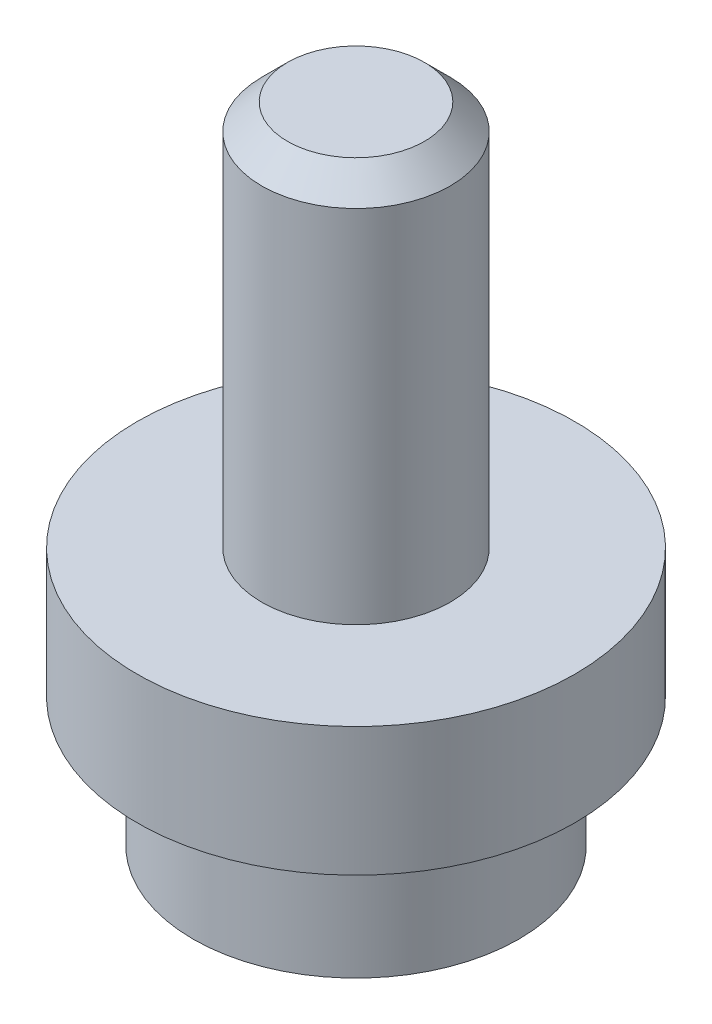
ISO-10303-21;
HEADER;
FILE_DESCRIPTION(('STEP AP214'),'2;1');
FILE_NAME('part.step','',(''),(''),'','','');
FILE_SCHEMA(('AUTOMOTIVE_DESIGN { 1 0 10303 214 1 1 1 1 }'));
ENDSEC;
DATA;
#1=APPLICATION_CONTEXT('core data for automotive mechanical design processes');
#2=APPLICATION_PROTOCOL_DEFINITION('international standard','automotive_design',2000,#1);
#3=PRODUCT_CONTEXT('',#1,'mechanical');
#4=PRODUCT('Part','Part','',(#3));
#5=PRODUCT_RELATED_PRODUCT_CATEGORY('part','',(#4));
#6=PRODUCT_DEFINITION_FORMATION('','',#4);
#7=PRODUCT_DEFINITION_CONTEXT('part definition',#1,'design');
#8=PRODUCT_DEFINITION('design','',#6,#7);
#9=PRODUCT_DEFINITION_SHAPE('','',#8);
#10=(LENGTH_UNIT() NAMED_UNIT(*) SI_UNIT(.MILLI.,.METRE.));
#11=(NAMED_UNIT(*) PLANE_ANGLE_UNIT() SI_UNIT($,.RADIAN.));
#12=(NAMED_UNIT(*) SI_UNIT($,.STERADIAN.) SOLID_ANGLE_UNIT());
#13=UNCERTAINTY_MEASURE_WITH_UNIT(LENGTH_MEASURE(1.E-05),#10,'distance_accuracy_value','');
#14=(GEOMETRIC_REPRESENTATION_CONTEXT(3) GLOBAL_UNCERTAINTY_ASSIGNED_CONTEXT((#13)) GLOBAL_UNIT_ASSIGNED_CONTEXT((#10,
#11,#12)) REPRESENTATION_CONTEXT('',''));
#15=CARTESIAN_POINT('',(0.,0.,0.));
#16=DIRECTION('',(0.,0.,1.));
#17=DIRECTION('',(1.,0.,0.));
#18=AXIS2_PLACEMENT_3D('',#15,#16,#17);
#19=CARTESIAN_POINT('',(0.,0.,0.));
#20=DIRECTION('',(0.,-1.,0.));
#21=DIRECTION('',(1.,0.,0.));
#22=AXIS2_PLACEMENT_3D('',#19,#20,#21);
#23=PLANE('',#22);
#24=CARTESIAN_POINT('',(0.,0.,0.));
#25=DIRECTION('',(0.,-1.,0.));
#26=DIRECTION('',(1.,0.,0.));
#27=AXIS2_PLACEMENT_3D('',#24,#25,#26);
#28=CIRCLE('',#27,6.325);
#29=CARTESIAN_POINT('',(6.325,0.,0.));
#30=VERTEX_POINT('',#29);
#31=EDGE_CURVE('E42',#30,#30,#28,.T.);
#32=ORIENTED_EDGE('',*,*,#31,.T.);
#33=EDGE_LOOP('',(#32));
#34=FACE_BOUND('',#33,.T.);
#35=ADVANCED_FACE('F31',(#34),#23,.T.);
#36=CARTESIAN_POINT('',(0.,25.,0.));
#37=DIRECTION('',(0.,-1.,0.));
#38=DIRECTION('',(1.,0.,0.));
#39=AXIS2_PLACEMENT_3D('',#36,#37,#38);
#40=CYLINDRICAL_SURFACE('',#39,6.325);
#41=CARTESIAN_POINT('',(0.,5.,0.));
#42=DIRECTION('',(0.,-1.,0.));
#43=DIRECTION('',(1.,0.,0.));
#44=AXIS2_PLACEMENT_3D('',#41,#42,#43);
#45=CIRCLE('',#44,6.325);
#46=CARTESIAN_POINT('',(6.325,5.,0.));
#47=VERTEX_POINT('',#46);
#48=EDGE_CURVE('E46',#47,#47,#45,.T.);
#49=ORIENTED_EDGE('',*,*,#48,.T.);
#50=EDGE_LOOP('',(#49));
#51=FACE_BOUND('',#50,.T.);
#52=ORIENTED_EDGE('',*,*,#31,.F.);
#53=EDGE_LOOP('',(#52));
#54=FACE_BOUND('',#53,.T.);
#55=ADVANCED_FACE('F76',(#51,#54),#40,.T.);
#56=CARTESIAN_POINT('',(6.325,5.,0.));
#57=DIRECTION('',(0.,-1.,0.));
#58=DIRECTION('',(1.,0.,0.));
#59=AXIS2_PLACEMENT_3D('',#56,#57,#58);
#60=PLANE('',#59);
#61=CARTESIAN_POINT('',(0.,5.,0.));
#62=DIRECTION('',(0.,-1.,0.));
#63=DIRECTION('',(1.,0.,0.));
#64=AXIS2_PLACEMENT_3D('',#61,#62,#63);
#65=CIRCLE('',#64,8.5);
#66=CARTESIAN_POINT('',(8.5,5.,0.));
#67=VERTEX_POINT('',#66);
#68=EDGE_CURVE('E51',#67,#67,#65,.T.);
#69=ORIENTED_EDGE('',*,*,#68,.T.);
#70=EDGE_LOOP('',(#69));
#71=FACE_BOUND('',#70,.T.);
#72=ORIENTED_EDGE('',*,*,#48,.F.);
#73=EDGE_LOOP('',(#72));
#74=FACE_BOUND('',#73,.T.);
#75=ADVANCED_FACE('F81',(#71,#74),#60,.T.);
#76=CARTESIAN_POINT('',(0.,25.,0.));
#77=DIRECTION('',(0.,-1.,0.));
#78=DIRECTION('',(1.,0.,0.));
#79=AXIS2_PLACEMENT_3D('',#76,#77,#78);
#80=CYLINDRICAL_SURFACE('',#79,8.5);
#81=CARTESIAN_POINT('',(0.,10.,0.));
#82=DIRECTION('',(0.,-1.,0.));
#83=DIRECTION('',(1.,0.,0.));
#84=AXIS2_PLACEMENT_3D('',#81,#82,#83);
#85=CIRCLE('',#84,8.5);
#86=CARTESIAN_POINT('',(8.5,10.,0.));
#87=VERTEX_POINT('',#86);
#88=EDGE_CURVE('E54',#87,#87,#85,.T.);
#89=ORIENTED_EDGE('',*,*,#88,.T.);
#90=EDGE_LOOP('',(#89));
#91=FACE_BOUND('',#90,.T.);
#92=ORIENTED_EDGE('',*,*,#68,.F.);
#93=EDGE_LOOP('',(#92));
#94=FACE_BOUND('',#93,.T.);
#95=ADVANCED_FACE('F73',(#91,#94),#80,.T.);
#96=CARTESIAN_POINT('',(8.5,10.,0.));
#97=DIRECTION('',(0.,1.,0.));
#98=DIRECTION('',(-1.,0.,0.));
#99=AXIS2_PLACEMENT_3D('',#96,#97,#98);
#100=PLANE('',#99);
#101=CARTESIAN_POINT('',(0.,10.,0.));
#102=DIRECTION('',(0.,-1.,0.));
#103=DIRECTION('',(1.,0.,0.));
#104=AXIS2_PLACEMENT_3D('',#101,#102,#103);
#105=CIRCLE('',#104,3.66);
#106=CARTESIAN_POINT('',(3.66,10.,0.));
#107=VERTEX_POINT('',#106);
#108=EDGE_CURVE('E57',#107,#107,#105,.T.);
#109=ORIENTED_EDGE('',*,*,#108,.T.);
#110=EDGE_LOOP('',(#109));
#111=FACE_BOUND('',#110,.T.);
#112=ORIENTED_EDGE('',*,*,#88,.F.);
#113=EDGE_LOOP('',(#112));
#114=FACE_BOUND('',#113,.T.);
#115=ADVANCED_FACE('F61',(#111,#114),#100,.T.);
#116=CARTESIAN_POINT('',(0.,25.,0.));
#117=DIRECTION('',(0.,-1.,0.));
#118=DIRECTION('',(1.,0.,0.));
#119=AXIS2_PLACEMENT_3D('',#116,#117,#118);
#120=CYLINDRICAL_SURFACE('',#119,3.66);
#121=CARTESIAN_POINT('',(0.,24.,0.));
#122=DIRECTION('',(0.,1.,0.));
#123=DIRECTION('',(-1.,0.,0.));
#124=AXIS2_PLACEMENT_3D('',#121,#122,#123);
#125=CIRCLE('',#124,3.66);
#126=CARTESIAN_POINT('',(-3.66,24.,0.));
#127=VERTEX_POINT('',#126);
#128=EDGE_CURVE('E38',#127,#127,#125,.F.);
#129=ORIENTED_EDGE('',*,*,#128,.T.);
#130=EDGE_LOOP('',(#129));
#131=FACE_BOUND('',#130,.T.);
#132=ORIENTED_EDGE('',*,*,#108,.F.);
#133=EDGE_LOOP('',(#132));
#134=FACE_BOUND('',#133,.T.);
#135=ADVANCED_FACE('F64',(#131,#134),#120,.T.);
#136=CARTESIAN_POINT('',(3.66,25.,0.));
#137=DIRECTION('',(0.,1.,0.));
#138=DIRECTION('',(-1.,0.,0.));
#139=AXIS2_PLACEMENT_3D('',#136,#137,#138);
#140=PLANE('',#139);
#141=CARTESIAN_POINT('',(0.,25.,0.));
#142=DIRECTION('',(0.,1.,0.));
#143=DIRECTION('',(-1.,0.,0.));
#144=AXIS2_PLACEMENT_3D('',#141,#142,#143);
#145=CIRCLE('',#144,2.66);
#146=CARTESIAN_POINT('',(-2.66,25.,0.));
#147=VERTEX_POINT('',#146);
#148=EDGE_CURVE('E10',#147,#147,#145,.T.);
#149=ORIENTED_EDGE('',*,*,#148,.T.);
#150=EDGE_LOOP('',(#149));
#151=FACE_BOUND('',#150,.T.);
#152=ADVANCED_FACE('F66',(#151),#140,.T.);
#153=CARTESIAN_POINT('',(0.,24.,0.));
#154=DIRECTION('',(0.,-1.,0.));
#155=DIRECTION('',(1.,0.,0.));
#156=AXIS2_PLACEMENT_3D('',#153,#154,#155);
#157=CONICAL_SURFACE('',#156,3.66,0.78539816339745);
#158=ORIENTED_EDGE('',*,*,#148,.F.);
#159=EDGE_LOOP('',(#158));
#160=FACE_BOUND('',#159,.T.);
#161=ORIENTED_EDGE('',*,*,#128,.F.);
#162=EDGE_LOOP('',(#161));
#163=FACE_BOUND('',#162,.T.);
#164=ADVANCED_FACE('F33',(#160,#163),#157,.T.);
#165=CLOSED_SHELL('',(#35,#55,#75,#95,#115,#135,#152,#164));
#166=MANIFOLD_SOLID_BREP('B2',#165);
#167=ADVANCED_BREP_SHAPE_REPRESENTATION('',(#18,#166),#14);
#168=SHAPE_DEFINITION_REPRESENTATION(#9,#167);
ENDSEC;
END-ISO-10303-21;
